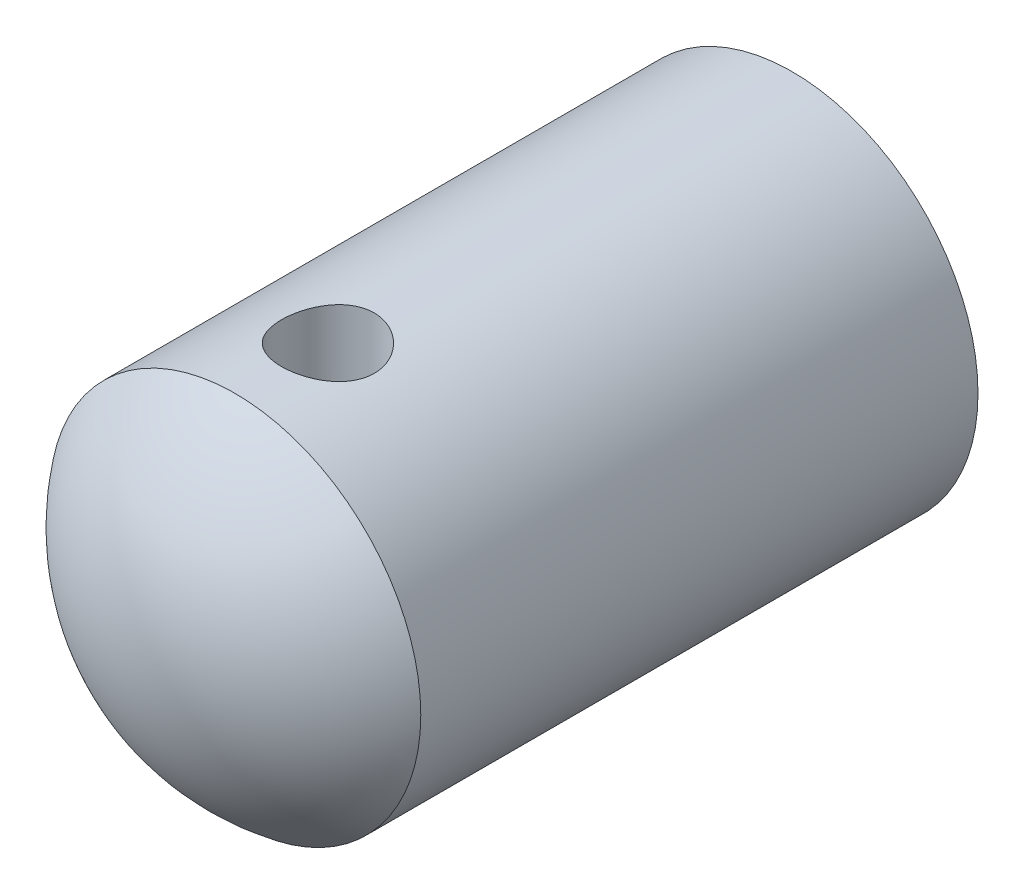
ISO-10303-21;
HEADER;
FILE_DESCRIPTION(('STEP AP214'),'2;1');
FILE_NAME('part.step','',(''),(''),'','','');
FILE_SCHEMA(('AUTOMOTIVE_DESIGN { 1 0 10303 214 1 1 1 1 }'));
ENDSEC;
DATA;
#1=APPLICATION_CONTEXT('core data for automotive mechanical design processes');
#2=APPLICATION_PROTOCOL_DEFINITION('international standard','automotive_design',2000,#1);
#3=PRODUCT_CONTEXT('',#1,'mechanical');
#4=PRODUCT('Part','Part','',(#3));
#5=PRODUCT_RELATED_PRODUCT_CATEGORY('part','',(#4));
#6=PRODUCT_DEFINITION_FORMATION('','',#4);
#7=PRODUCT_DEFINITION_CONTEXT('part definition',#1,'design');
#8=PRODUCT_DEFINITION('design','',#6,#7);
#9=PRODUCT_DEFINITION_SHAPE('','',#8);
#10=(LENGTH_UNIT() NAMED_UNIT(*) SI_UNIT(.MILLI.,.METRE.));
#11=(NAMED_UNIT(*) PLANE_ANGLE_UNIT() SI_UNIT($,.RADIAN.));
#12=(NAMED_UNIT(*) SI_UNIT($,.STERADIAN.) SOLID_ANGLE_UNIT());
#13=UNCERTAINTY_MEASURE_WITH_UNIT(LENGTH_MEASURE(1.E-05),#10,'distance_accuracy_value','');
#14=(GEOMETRIC_REPRESENTATION_CONTEXT(3) GLOBAL_UNCERTAINTY_ASSIGNED_CONTEXT((#13)) GLOBAL_UNIT_ASSIGNED_CONTEXT((#10,
#11,#12)) REPRESENTATION_CONTEXT('',''));
#15=CARTESIAN_POINT('',(0.,0.,0.));
#16=DIRECTION('',(0.,0.,1.));
#17=DIRECTION('',(1.,0.,0.));
#18=AXIS2_PLACEMENT_3D('',#15,#16,#17);
#19=CARTESIAN_POINT('',(0.,0.,120.));
#20=DIRECTION('',(0.,0.,-1.));
#21=DIRECTION('',(-1.,0.,0.));
#22=AXIS2_PLACEMENT_3D('',#19,#20,#21);
#23=CYLINDRICAL_SURFACE('',#22,40.);
#24=CARTESIAN_POINT('',(0.,-40.,110.));
#25=CARTESIAN_POINT('',(0.276276686131213,-39.9999993474412,109.999998834029));
#26=CARTESIAN_POINT('',(0.552576783631185,-39.9971305425548,109.988541017278));
#27=CARTESIAN_POINT('',(1.10318148436561,-39.9857330256128,109.942802754829));
#28=CARTESIAN_POINT('',(1.37748585631468,-39.9772036677926,109.908519705193));
#29=CARTESIAN_POINT('',(1.9222336066517,-39.9547164363919,109.817398561938));
#30=CARTESIAN_POINT('',(2.19267505387194,-39.9407559397862,109.760549569592));
#31=CARTESIAN_POINT('',(2.72764291200183,-39.907791142276,109.624766293579));
#32=CARTESIAN_POINT('',(2.9921691888711,-39.8887867271994,109.545831509985));
#33=CARTESIAN_POINT('',(3.51314528556497,-39.8462801108945,109.366621628135));
#34=CARTESIAN_POINT('',(3.76960471060799,-39.8227835143951,109.26637310496));
#35=CARTESIAN_POINT('',(4.27306727635446,-39.7719112039748,109.045246902843));
#36=CARTESIAN_POINT('',(4.52007036697146,-39.7445354695114,108.924369114656));
#37=CARTESIAN_POINT('',(5.00296312812469,-39.6866412375216,108.662894261255));
#38=CARTESIAN_POINT('',(5.23885470211663,-39.6561232811474,108.522300589999));
#39=CARTESIAN_POINT('',(5.69814612012694,-39.5927379916158,108.222310872375));
#40=CARTESIAN_POINT('',(5.92154144861157,-39.5598698188549,108.062908093187));
#41=CARTESIAN_POINT('',(6.35826451188649,-39.4920522419941,107.723364111462));
#42=CARTESIAN_POINT('',(6.57133697514704,-39.4570759423501,107.542899879583));
#43=CARTESIAN_POINT('',(6.98169544574758,-39.3865370660522,107.16476180459));
#44=CARTESIAN_POINT('',(7.17897420534623,-39.3509742291619,106.967080146287));
#45=CARTESIAN_POINT('',(7.5563689006375,-39.2802515251638,106.555850880297));
#46=CARTESIAN_POINT('',(7.73648287233044,-39.2450917045731,106.342301461981));
#47=CARTESIAN_POINT('',(8.07823801416378,-39.176172014405,105.900843693481));
#48=CARTESIAN_POINT('',(8.23988747905261,-39.1424115205899,105.672941862732));
#49=CARTESIAN_POINT('',(8.54601878600911,-39.0767252483032,105.20057500516));
#50=CARTESIAN_POINT('',(8.69019944369822,-39.0448355320653,104.955909616724));
#51=CARTESIAN_POINT('',(8.95732951917683,-38.9844200167823,104.45497352556));
#52=CARTESIAN_POINT('',(9.08028719545704,-38.9558929106225,104.198707386251));
#53=CARTESIAN_POINT('',(9.30408470665821,-38.9030492204288,103.676244662164));
#54=CARTESIAN_POINT('',(9.40492284026946,-38.8787329602997,103.410047315376));
#55=CARTESIAN_POINT('',(9.58363487145948,-38.8350668183171,102.869656183086));
#56=CARTESIAN_POINT('',(9.66150931910943,-38.8157168175037,102.595462589298));
#57=CARTESIAN_POINT('',(9.79230027358012,-38.7829255292181,102.046662445358));
#58=CARTESIAN_POINT('',(9.84568542228694,-38.7693736587141,101.772174161763));
#59=CARTESIAN_POINT('',(9.92930040805545,-38.7480433223281,101.219470103496));
#60=CARTESIAN_POINT('',(9.95953052583201,-38.7402647864543,100.941254374053));
#61=CARTESIAN_POINT('',(9.99656649300495,-38.7307245693961,100.383204676321));
#62=CARTESIAN_POINT('',(10.0033756681978,-38.7289620339339,100.103370943442));
#63=CARTESIAN_POINT('',(9.99351800395716,-38.7315068742112,99.5441471923369));
#64=CARTESIAN_POINT('',(9.97685149095119,-38.7358141655503,99.264757167995));
#65=CARTESIAN_POINT('',(9.92088090803788,-38.7501861592384,98.7152697683662));
#66=CARTESIAN_POINT('',(9.88213622905447,-38.7601085512958,98.4451114596009));
#67=CARTESIAN_POINT('',(9.7827640364595,-38.7853084477115,97.9091104962177));
#68=CARTESIAN_POINT('',(9.72213692994241,-38.8005858524465,97.6432677614104));
#69=CARTESIAN_POINT('',(9.5794994253827,-38.8360474723497,97.1177596286762));
#70=CARTESIAN_POINT('',(9.49749183020054,-38.8562310443238,96.8580934259066));
#71=CARTESIAN_POINT('',(9.3126930925472,-38.9009354625423,96.346544686431));
#72=CARTESIAN_POINT('',(9.20989415752296,-38.9254579345653,96.0946651090638));
#73=CARTESIAN_POINT('',(8.98318087798949,-38.9784060382958,95.5979870615736));
#74=CARTESIAN_POINT('',(8.85906808208168,-39.0068678154364,95.3532830550915));
#75=CARTESIAN_POINT('',(8.59133539716697,-39.0667091387545,94.875155226747));
#76=CARTESIAN_POINT('',(8.44771463246085,-39.0980888158945,94.6417319119052));
#77=CARTESIAN_POINT('',(8.14193923712406,-39.1629064792632,94.1876197412456));
#78=CARTESIAN_POINT('',(7.97978227057928,-39.196344724665,93.9669324956998));
#79=CARTESIAN_POINT('',(7.63801932614917,-39.2643733021678,93.5396983316009));
#80=CARTESIAN_POINT('',(7.45841302952062,-39.2989636553065,93.3331516714683));
#81=CARTESIAN_POINT('',(7.07753342014247,-39.3693672656826,92.9298063758053));
#82=CARTESIAN_POINT('',(6.87578778904274,-39.4051872340633,92.7334546345399));
#83=CARTESIAN_POINT('',(6.45639557413328,-39.4760709124524,92.3583970307196));
#84=CARTESIAN_POINT('',(6.23874924957814,-39.5111346347791,92.1796908805719));
#85=CARTESIAN_POINT('',(5.78892992120895,-39.579540756308,91.8411059550386));
#86=CARTESIAN_POINT('',(5.55675333032784,-39.6128827267264,91.6812318569949));
#87=CARTESIAN_POINT('',(5.07955796537571,-39.6768951897208,91.3815640634134));
#88=CARTESIAN_POINT('',(4.83454420385182,-39.7075667127597,91.2417626086746));
#89=CARTESIAN_POINT('',(4.33232990172721,-39.765500548439,90.982736830804));
#90=CARTESIAN_POINT('',(4.07508804682037,-39.7927499750226,90.863589677737));
#91=CARTESIAN_POINT('',(3.55104953194883,-39.842933142722,90.6474399445035));
#92=CARTESIAN_POINT('',(3.28425281831401,-39.8658668595916,90.5504374887476));
#93=CARTESIAN_POINT('',(2.74306842511355,-39.9067562557545,90.3793921231009));
#94=CARTESIAN_POINT('',(2.468681934248,-39.9247127097788,90.3053456398076));
#95=CARTESIAN_POINT('',(1.91431246833766,-39.9551305553882,90.1808295155556));
#96=CARTESIAN_POINT('',(1.63432963144589,-39.9675920824478,90.1303592933341));
#97=CARTESIAN_POINT('',(1.07810473910744,-39.9864118920525,90.0544255275337));
#98=CARTESIAN_POINT('',(0.801950449451516,-39.9929182716286,90.0283548039809));
#99=CARTESIAN_POINT('',(0.248356982178921,-40.0001867706141,89.9992428793427));
#100=CARTESIAN_POINT('',(-0.0290821734368928,-40.00094898802,89.9962012853759));
#101=CARTESIAN_POINT('',(-0.583185768536729,-39.9967080274712,90.0131727122316));
#102=CARTESIAN_POINT('',(-0.859850270347598,-39.991705327538,90.0331838215452));
#103=CARTESIAN_POINT('',(-1.41040357408703,-39.9760753561965,90.0960852537547));
#104=CARTESIAN_POINT('',(-1.684292386864,-39.9654481067795,90.1389754871954));
#105=CARTESIAN_POINT('',(-2.22327800001183,-39.9390630903775,90.2464658772862));
#106=CARTESIAN_POINT('',(-2.48844496615133,-39.9233838802729,90.3107340771903));
#107=CARTESIAN_POINT('',(-3.01234098850949,-39.8872755198411,90.460606222222));
#108=CARTESIAN_POINT('',(-3.27107012780182,-39.8668464308415,90.5462098918797));
#109=CARTESIAN_POINT('',(-3.78033449341546,-39.8217832029462,90.7380829916468));
#110=CARTESIAN_POINT('',(-4.03087057538303,-39.7971495048429,90.8443502556393));
#111=CARTESIAN_POINT('',(-4.52223860683227,-39.7443134144047,91.076813406541));
#112=CARTESIAN_POINT('',(-4.76306687714366,-39.7161096855189,91.2030167615497));
#113=CARTESIAN_POINT('',(-5.23752187646089,-39.6563555782416,91.4768144391436));
#114=CARTESIAN_POINT('',(-5.47094820846399,-39.624755177931,91.6247451226261));
#115=CARTESIAN_POINT('',(-5.92457828206943,-39.5594728981749,91.9392585277773));
#116=CARTESIAN_POINT('',(-6.14478145192341,-39.5257909288532,92.1058420550742));
#117=CARTESIAN_POINT('',(-6.57058731767183,-39.4572414078492,92.4565610770555));
#118=CARTESIAN_POINT('',(-6.77618804792627,-39.4223736974844,92.6406989269493));
#119=CARTESIAN_POINT('',(-7.17145280648187,-39.352389485896,93.0253094937133));
#120=CARTESIAN_POINT('',(-7.36111662432891,-39.3172729813935,93.2257824262268));
#121=CARTESIAN_POINT('',(-7.72774540600503,-39.2468808270323,93.6469067875468));
#122=CARTESIAN_POINT('',(-7.90428315344572,-39.2116225166925,93.8679333114596));
#123=CARTESIAN_POINT('',(-8.23811583861649,-39.1428473927591,94.3243169121817));
#124=CARTESIAN_POINT('',(-8.39541126484779,-39.1093305349678,94.5596736249657));
#125=CARTESIAN_POINT('',(-8.68966091610262,-39.0450059331012,95.0431965511685));
#126=CARTESIAN_POINT('',(-8.826611225845,-39.0141987109411,95.2913652178113));
#127=CARTESIAN_POINT('',(-9.07904857587184,-38.9562273945278,95.7986770336816));
#128=CARTESIAN_POINT('',(-9.19454421025633,-38.9290618427496,96.0578157373428));
#129=CARTESIAN_POINT('',(-9.40261638230816,-38.879328567111,96.58381347658));
#130=CARTESIAN_POINT('',(-9.4953221211479,-38.8567350588003,96.850618939403));
#131=CARTESIAN_POINT('',(-9.65791512678119,-38.8166419949047,97.3914732005703));
#132=CARTESIAN_POINT('',(-9.72780242555448,-38.7991424321806,97.6655219887626));
#133=CARTESIAN_POINT('',(-9.84414605907407,-38.7697871241357,98.218796716723));
#134=CARTESIAN_POINT('',(-9.89060669326283,-38.7579303432304,98.4980216967569));
#135=CARTESIAN_POINT('',(-9.95970176366048,-38.740232565125,99.0595913221852));
#136=CARTESIAN_POINT('',(-9.98233677310327,-38.7343914231915,99.3419358923586));
#137=CARTESIAN_POINT('',(-10.0032722204452,-38.7289898198564,99.8994475489982));
#138=CARTESIAN_POINT('',(-10.0022536208647,-38.7292536033208,100.174587591908));
#139=CARTESIAN_POINT('',(-9.97755972226948,-38.7356226876572,100.723776907411));
#140=CARTESIAN_POINT('',(-9.95388488170566,-38.741727870328,100.997826201963));
#141=CARTESIAN_POINT('',(-9.88408248409727,-38.7595950267271,101.542852997241));
#142=CARTESIAN_POINT('',(-9.83795552407141,-38.771356850041,101.81383057945));
#143=CARTESIAN_POINT('',(-9.72363550707292,-38.8001853309248,102.350801016534));
#144=CARTESIAN_POINT('',(-9.65544233948357,-38.8172520150877,102.616793846414));
#145=CARTESIAN_POINT('',(-9.49803119722784,-38.8560667748234,103.140328204053));
#146=CARTESIAN_POINT('',(-9.40894556510169,-38.8777853112568,103.397911755833));
#147=CARTESIAN_POINT('',(-9.21017526998103,-38.9253530530372,103.904713754185));
#148=CARTESIAN_POINT('',(-9.10048316605147,-38.9512037499907,104.153929140599));
#149=CARTESIAN_POINT('',(-8.86133636008454,-39.0063041604206,104.642265452049));
#150=CARTESIAN_POINT('',(-8.73188345974384,-39.0355535639609,104.881387294832));
#151=CARTESIAN_POINT('',(-8.45410693455431,-39.0966532023658,105.348066951001));
#152=CARTESIAN_POINT('',(-8.30578240349574,-39.1285035621011,105.575624208325));
#153=CARTESIAN_POINT('',(-7.98715019319339,-39.1948030871517,106.023530819321));
#154=CARTESIAN_POINT('',(-7.81637004459894,-39.2292983680228,106.243537368254));
#155=CARTESIAN_POINT('',(-7.45713945647237,-39.2991672194456,106.668468963869));
#156=CARTESIAN_POINT('',(-7.2686887399824,-39.3345408037568,106.873393774077));
#157=CARTESIAN_POINT('',(-6.87530741513624,-39.4052037523679,107.266881073601));
#158=CARTESIAN_POINT('',(-6.67037284045601,-39.4404930942815,107.455439602054));
#159=CARTESIAN_POINT('',(-6.24539503784925,-39.5100163411835,107.814889147313));
#160=CARTESIAN_POINT('',(-6.0253521279286,-39.5442502683646,107.985780535795));
#161=CARTESIAN_POINT('',(-5.56740359032029,-39.6113435460404,108.311705186542));
#162=CARTESIAN_POINT('',(-5.32924418986214,-39.6441661227826,108.466389716296));
#163=CARTESIAN_POINT('',(-4.84042651516458,-39.7068124330665,108.755044537687));
#164=CARTESIAN_POINT('',(-4.58977286613402,-39.7366372641816,108.88902242044));
#165=CARTESIAN_POINT('',(-4.07773321835857,-39.7924413064267,109.135248391094));
#166=CARTESIAN_POINT('',(-3.81635191156582,-39.8184221763682,109.247505858633));
#167=CARTESIAN_POINT('',(-3.28463135766317,-39.8658048489492,109.449446743792));
#168=CARTESIAN_POINT('',(-3.01429346885352,-39.8872073422793,109.539133566764));
#169=CARTESIAN_POINT('',(-2.51829671794581,-39.9212703038144,109.68047406555));
#170=CARTESIAN_POINT('',(-2.29382401207508,-39.9348181936603,109.736110394683));
#171=CARTESIAN_POINT('',(-1.84138358325463,-39.9582356855493,109.83172183439));
#172=CARTESIAN_POINT('',(-1.61341610527137,-39.9681055441881,109.871698037494));
#173=CARTESIAN_POINT('',(-1.15510194680525,-39.9839757782934,109.935757826292));
#174=CARTESIAN_POINT('',(-0.924755035654602,-39.9899757749611,109.9598398562));
#175=CARTESIAN_POINT('',(-0.462944023658253,-39.9979876402783,109.991959343887));
#176=CARTESIAN_POINT('',(-0.231480229261553,-40.0000005467506,110.000000976916));
#177=CARTESIAN_POINT('',(0.,-40.,110.));
#178=B_SPLINE_CURVE_WITH_KNOTS('',3,(#24,#25,#26,#27,#28,#29,#30,#31,#32,#33,#34,#35,#36,#37,
#38,#39,#40,#41,#42,#43,#44,#45,#46,#47,#48,#49,#50,#51,#52,#53,#54,#55,#56,#57,#58,#59,#60,#61,
#62,#63,#64,#65,#66,#67,#68,#69,#70,#71,#72,#73,#74,#75,#76,#77,#78,#79,#80,#81,#82,#83,#84,#85,
#86,#87,#88,#89,#90,#91,#92,#93,#94,#95,#96,#97,#98,#99,#100,#101,#102,#103,#104,#105,#106,#107,
#108,#109,#110,#111,#112,#113,#114,#115,#116,#117,#118,#119,#120,#121,#122,#123,#124,#125,#126,
#127,#128,#129,#130,#131,#132,#133,#134,#135,#136,#137,#138,#139,#140,#141,#142,#143,#144,#145,
#146,#147,#148,#149,#150,#151,#152,#153,#154,#155,#156,#157,#158,#159,#160,#161,#162,#163,#164,
#165,#166,#167,#168,#169,#170,#171,#172,#173,#174,#175,#176,#177),.UNSPECIFIED.,.T.,.F.,(4,2,2,
2,2,2,2,2,2,2,2,2,2,2,2,2,2,2,2,2,2,2,2,2,2,2,2,2,2,2,2,2,2,2,2,2,2,2,2,2,2,2,2,2,2,2,2,2,2,2,2,
2,2,2,2,2,2,2,2,2,2,2,2,2,2,2,2,2,2,2,2,2,2,2,2,2,4),(0.,0.828619089346024,1.65733272509384,
2.48644709461136,3.31558023322879,4.14368556550279,4.97179528331468,5.79976262221085,
6.62802724066694,7.47127713116486,8.31491179752392,9.15864287718379,10.0019934272018,
10.8582731380175,11.7142188901354,12.5702304536773,13.4262215106876,14.2650679436646,
15.1039042069121,15.9426213496824,16.7813268302768,17.5996711950355,18.4180003363331,
19.2362222532306,20.0547514082784,20.8813618760701,21.7080094621042,22.5347613365453,
23.3615283159286,24.2119083751323,25.0622745723147,25.9128515327318,26.7630988071573,
27.6164573976883,28.4698207823288,29.3230512628311,30.1762607061874,31.0076247471077,
31.8389746047657,32.6702555326212,33.501533210271,34.3204625761169,35.1393813690201,
35.958214362793,36.7773548236264,37.6108625247906,38.4444062395818,39.2780619461831,
40.1117286598548,40.9659053768095,41.8200604044369,42.6743795961243,43.5283558317059,
44.3773728438563,45.2263886661149,46.0752486136646,46.9240881375558,47.7485215778696,
48.5729383360593,49.3973331735861,50.2217321438248,51.041043688627,51.8606516550366,
52.6801849380243,53.4997575896047,54.3407066639187,55.1816689209665,56.0228341380647,
56.8639816554284,57.7205715620531,58.5768466916346,59.4327512222289,60.2885265404584,
60.9829517481761,61.6773285006459,62.3717732114252,63.0660371374129),.UNSPECIFIED.);
#179=CARTESIAN_POINT('',(0.,-40.,110.));
#180=VERTEX_POINT('',#179);
#181=EDGE_CURVE('E54',#180,#180,#178,.T.);
#182=ORIENTED_EDGE('',*,*,#181,.T.);
#183=EDGE_LOOP('',(#182));
#184=FACE_BOUND('',#183,.T.);
#185=CARTESIAN_POINT('',(0.,0.,120.));
#186=DIRECTION('',(0.,0.,1.));
#187=DIRECTION('',(1.,0.,0.));
#188=AXIS2_PLACEMENT_3D('',#185,#186,#187);
#189=CIRCLE('',#188,40.);
#190=CARTESIAN_POINT('',(40.,0.,120.));
#191=VERTEX_POINT('',#190);
#192=EDGE_CURVE('E10',#191,#191,#189,.T.);
#193=ORIENTED_EDGE('',*,*,#192,.F.);
#194=EDGE_LOOP('',(#193));
#195=FACE_BOUND('',#194,.T.);
#196=CARTESIAN_POINT('',(0.,0.,0.));
#197=DIRECTION('',(0.,0.,1.));
#198=DIRECTION('',(1.,0.,0.));
#199=AXIS2_PLACEMENT_3D('',#196,#197,#198);
#200=CIRCLE('',#199,40.);
#201=CARTESIAN_POINT('',(40.,0.,0.));
#202=VERTEX_POINT('',#201);
#203=EDGE_CURVE('E37',#202,#202,#200,.T.);
#204=ORIENTED_EDGE('',*,*,#203,.T.);
#205=EDGE_LOOP('',(#204));
#206=FACE_BOUND('',#205,.T.);
#207=CARTESIAN_POINT('',(0.,40.,90.));
#208=CARTESIAN_POINT('',(-0.276276686131213,39.9999993474412,90.000001165971));
#209=CARTESIAN_POINT('',(-0.552576783631185,39.9971305425548,90.0114589827224));
#210=CARTESIAN_POINT('',(-1.10318148436561,39.9857330256128,90.0571972451707));
#211=CARTESIAN_POINT('',(-1.37748585631468,39.9772036677926,90.0914802948069));
#212=CARTESIAN_POINT('',(-1.9222336066517,39.9547164363919,90.1826014380616));
#213=CARTESIAN_POINT('',(-2.19267505387194,39.9407559397862,90.239450430408));
#214=CARTESIAN_POINT('',(-2.72764291200183,39.907791142276,90.3752337064209));
#215=CARTESIAN_POINT('',(-2.9921691888711,39.8887867271994,90.4541684900147));
#216=CARTESIAN_POINT('',(-3.51314528556497,39.8462801108945,90.6333783718649));
#217=CARTESIAN_POINT('',(-3.76960471060799,39.8227835143951,90.7336268950404));
#218=CARTESIAN_POINT('',(-4.27306727635446,39.7719112039748,90.9547530971568));
#219=CARTESIAN_POINT('',(-4.52007036697146,39.7445354695114,91.0756308853443));
#220=CARTESIAN_POINT('',(-5.00296312812469,39.6866412375216,91.3371057387446));
#221=CARTESIAN_POINT('',(-5.23885470211663,39.6561232811474,91.477699410001));
#222=CARTESIAN_POINT('',(-5.69814612012694,39.5927379916158,91.777689127625));
#223=CARTESIAN_POINT('',(-5.92154144861157,39.5598698188549,91.9370919068127));
#224=CARTESIAN_POINT('',(-6.35826451188649,39.4920522419941,92.2766358885384));
#225=CARTESIAN_POINT('',(-6.57133697514704,39.4570759423501,92.4571001204172));
#226=CARTESIAN_POINT('',(-6.98169544574758,39.3865370660522,92.8352381954096));
#227=CARTESIAN_POINT('',(-7.17897420534624,39.3509742291619,93.0329198537134));
#228=CARTESIAN_POINT('',(-7.5563689006375,39.2802515251638,93.4441491197031));
#229=CARTESIAN_POINT('',(-7.73648287233043,39.2450917045731,93.6576985380191));
#230=CARTESIAN_POINT('',(-8.07823801416377,39.176172014405,94.0991563065186));
#231=CARTESIAN_POINT('',(-8.2398874790526,39.1424115205899,94.3270581372682));
#232=CARTESIAN_POINT('',(-8.54601878600911,39.0767252483032,94.7994249948401));
#233=CARTESIAN_POINT('',(-8.69019944369822,39.0448355320653,95.0440903832765));
#234=CARTESIAN_POINT('',(-8.95732951917683,38.9844200167823,95.5450264744405));
#235=CARTESIAN_POINT('',(-9.08028719545704,38.9558929106225,95.8012926137494));
#236=CARTESIAN_POINT('',(-9.3040847066582,38.9030492204288,96.3237553378355));
#237=CARTESIAN_POINT('',(-9.40492284026946,38.8787329602997,96.5899526846236));
#238=CARTESIAN_POINT('',(-9.58363487145948,38.8350668183171,97.1303438169142));
#239=CARTESIAN_POINT('',(-9.66150931910942,38.8157168175037,97.404537410702));
#240=CARTESIAN_POINT('',(-9.79230027358011,38.7829255292181,97.9533375546424));
#241=CARTESIAN_POINT('',(-9.84568542228694,38.7693736587141,98.227825838237));
#242=CARTESIAN_POINT('',(-9.92930040805545,38.7480433223281,98.7805298965043));
#243=CARTESIAN_POINT('',(-9.959530525832,38.7402647864544,99.0587456259466));
#244=CARTESIAN_POINT('',(-9.99656649300495,38.7307245693961,99.6167953236792));
#245=CARTESIAN_POINT('',(-10.0033756681978,38.7289620339339,99.896629056558));
#246=CARTESIAN_POINT('',(-9.99351800395716,38.7315068742112,100.455852807663));
#247=CARTESIAN_POINT('',(-9.97685149095119,38.7358141655503,100.735242832005));
#248=CARTESIAN_POINT('',(-9.92088090803788,38.7501861592384,101.284730231634));
#249=CARTESIAN_POINT('',(-9.88213622905447,38.7601085512958,101.554888540399));
#250=CARTESIAN_POINT('',(-9.7827640364595,38.7853084477115,102.090889503782));
#251=CARTESIAN_POINT('',(-9.7221369299424,38.8005858524465,102.35673223859));
#252=CARTESIAN_POINT('',(-9.5794994253827,38.8360474723497,102.882240371324));
#253=CARTESIAN_POINT('',(-9.49749183020054,38.8562310443238,103.141906574093));
#254=CARTESIAN_POINT('',(-9.3126930925472,38.9009354625423,103.653455313569));
#255=CARTESIAN_POINT('',(-9.20989415752296,38.9254579345653,103.905334890936));
#256=CARTESIAN_POINT('',(-8.98318087798949,38.9784060382958,104.402012938426));
#257=CARTESIAN_POINT('',(-8.85906808208167,39.0068678154364,104.646716944909));
#258=CARTESIAN_POINT('',(-8.59133539716696,39.0667091387545,105.124844773253));
#259=CARTESIAN_POINT('',(-8.44771463246085,39.0980888158945,105.358268088095));
#260=CARTESIAN_POINT('',(-8.14193923712406,39.1629064792632,105.812380258754));
#261=CARTESIAN_POINT('',(-7.97978227057928,39.196344724665,106.0330675043));
#262=CARTESIAN_POINT('',(-7.63801932614917,39.2643733021678,106.460301668399));
#263=CARTESIAN_POINT('',(-7.45841302952062,39.2989636553065,106.666848328532));
#264=CARTESIAN_POINT('',(-7.07753342014247,39.3693672656826,107.070193624195));
#265=CARTESIAN_POINT('',(-6.87578778904274,39.4051872340633,107.26654536546));
#266=CARTESIAN_POINT('',(-6.45639557413328,39.4760709124524,107.64160296928));
#267=CARTESIAN_POINT('',(-6.23874924957814,39.5111346347791,107.820309119428));
#268=CARTESIAN_POINT('',(-5.78892992120895,39.579540756308,108.158894044961));
#269=CARTESIAN_POINT('',(-5.55675333032784,39.6128827267264,108.318768143005));
#270=CARTESIAN_POINT('',(-5.07955796537571,39.6768951897208,108.618435936587));
#271=CARTESIAN_POINT('',(-4.83454420385182,39.7075667127597,108.758237391325));
#272=CARTESIAN_POINT('',(-4.33232990172721,39.765500548439,109.017263169196));
#273=CARTESIAN_POINT('',(-4.07508804682037,39.7927499750226,109.136410322263));
#274=CARTESIAN_POINT('',(-3.55104953194883,39.842933142722,109.352560055496));
#275=CARTESIAN_POINT('',(-3.28425281831401,39.8658668595916,109.449562511252));
#276=CARTESIAN_POINT('',(-2.74306842511355,39.9067562557545,109.620607876899));
#277=CARTESIAN_POINT('',(-2.468681934248,39.9247127097788,109.694654360192));
#278=CARTESIAN_POINT('',(-1.91431246833766,39.9551305553882,109.819170484444));
#279=CARTESIAN_POINT('',(-1.6343296314459,39.9675920824478,109.869640706666));
#280=CARTESIAN_POINT('',(-1.07810473910744,39.9864118920525,109.945574472466));
#281=CARTESIAN_POINT('',(-0.801950449451516,39.9929182716286,109.971645196019));
#282=CARTESIAN_POINT('',(-0.248356982178921,40.0001867706141,110.000757120657));
#283=CARTESIAN_POINT('',(0.0290821734368927,40.00094898802,110.003798714624));
#284=CARTESIAN_POINT('',(0.583185768536729,39.9967080274712,109.986827287768));
#285=CARTESIAN_POINT('',(0.859850270347598,39.991705327538,109.966816178455));
#286=CARTESIAN_POINT('',(1.41040357408703,39.9760753561965,109.903914746245));
#287=CARTESIAN_POINT('',(1.684292386864,39.9654481067795,109.861024512805));
#288=CARTESIAN_POINT('',(2.22327800001183,39.9390630903775,109.753534122714));
#289=CARTESIAN_POINT('',(2.48844496615132,39.9233838802729,109.68926592281));
#290=CARTESIAN_POINT('',(3.01234098850949,39.8872755198411,109.539393777778));
#291=CARTESIAN_POINT('',(3.27107012780182,39.8668464308415,109.45379010812));
#292=CARTESIAN_POINT('',(3.78033449341545,39.8217832029462,109.261917008353));
#293=CARTESIAN_POINT('',(4.03087057538302,39.7971495048429,109.155649744361));
#294=CARTESIAN_POINT('',(4.52223860683226,39.7443134144047,108.923186593459));
#295=CARTESIAN_POINT('',(4.76306687714365,39.7161096855189,108.79698323845));
#296=CARTESIAN_POINT('',(5.23752187646089,39.6563555782416,108.523185560856));
#297=CARTESIAN_POINT('',(5.47094820846398,39.624755177931,108.375254877374));
#298=CARTESIAN_POINT('',(5.92457828206942,39.5594728981749,108.060741472223));
#299=CARTESIAN_POINT('',(6.14478145192339,39.5257909288532,107.894157944926));
#300=CARTESIAN_POINT('',(6.57058731767181,39.4572414078492,107.543438922945));
#301=CARTESIAN_POINT('',(6.77618804792625,39.4223736974844,107.359301073051));
#302=CARTESIAN_POINT('',(7.17145280648186,39.352389485896,106.974690506287));
#303=CARTESIAN_POINT('',(7.3611166243289,39.3172729813935,106.774217573773));
#304=CARTESIAN_POINT('',(7.72774540600503,39.2468808270323,106.353093212453));
#305=CARTESIAN_POINT('',(7.90428315344572,39.2116225166925,106.13206668854));
#306=CARTESIAN_POINT('',(8.23811583861649,39.1428473927591,105.675683087818));
#307=CARTESIAN_POINT('',(8.39541126484779,39.1093305349678,105.440326375034));
#308=CARTESIAN_POINT('',(8.68966091610262,39.0450059331012,104.956803448832));
#309=CARTESIAN_POINT('',(8.826611225845,39.0141987109411,104.708634782189));
#310=CARTESIAN_POINT('',(9.07904857587184,38.9562273945278,104.201322966318));
#311=CARTESIAN_POINT('',(9.19454421025633,38.9290618427496,103.942184262657));
#312=CARTESIAN_POINT('',(9.40261638230816,38.879328567111,103.41618652342));
#313=CARTESIAN_POINT('',(9.4953221211479,38.8567350588003,103.149381060597));
#314=CARTESIAN_POINT('',(9.65791512678119,38.8166419949047,102.60852679943));
#315=CARTESIAN_POINT('',(9.72780242555448,38.7991424321806,102.334478011237));
#316=CARTESIAN_POINT('',(9.84414605907407,38.7697871241357,101.781203283277));
#317=CARTESIAN_POINT('',(9.89060669326283,38.7579303432304,101.501978303243));
#318=CARTESIAN_POINT('',(9.95970176366048,38.740232565125,100.940408677815));
#319=CARTESIAN_POINT('',(9.98233677310327,38.7343914231915,100.658064107641));
#320=CARTESIAN_POINT('',(10.0032722204452,38.7289898198564,100.100552451002));
#321=CARTESIAN_POINT('',(10.0022536208647,38.7292536033208,99.8254124080922));
#322=CARTESIAN_POINT('',(9.97755972226948,38.7356226876572,99.2762230925891));
#323=CARTESIAN_POINT('',(9.95388488170566,38.741727870328,99.0021737980369));
#324=CARTESIAN_POINT('',(9.88408248409728,38.7595950267271,98.4571470027588));
#325=CARTESIAN_POINT('',(9.83795552407141,38.771356850041,98.1861694205499));
#326=CARTESIAN_POINT('',(9.72363550707292,38.8001853309248,97.649198983466));
#327=CARTESIAN_POINT('',(9.65544233948357,38.8172520150877,97.3832061535864));
#328=CARTESIAN_POINT('',(9.49803119722784,38.8560667748234,96.8596717959474));
#329=CARTESIAN_POINT('',(9.40894556510169,38.8777853112568,96.6020882441674));
#330=CARTESIAN_POINT('',(9.21017526998103,38.9253530530372,96.0952862458155));
#331=CARTESIAN_POINT('',(9.10048316605147,38.9512037499907,95.8460708594006));
#332=CARTESIAN_POINT('',(8.86133636008454,39.0063041604206,95.3577345479506));
#333=CARTESIAN_POINT('',(8.73188345974384,39.0355535639609,95.1186127051682));
#334=CARTESIAN_POINT('',(8.45410693455431,39.0966532023658,94.6519330489992));
#335=CARTESIAN_POINT('',(8.30578240349574,39.1285035621011,94.4243757916751));
#336=CARTESIAN_POINT('',(7.98715019319339,39.1948030871517,93.9764691806793));
#337=CARTESIAN_POINT('',(7.81637004459894,39.2292983680228,93.7564626317456));
#338=CARTESIAN_POINT('',(7.45713945647237,39.2991672194456,93.3315310361314));
#339=CARTESIAN_POINT('',(7.2686887399824,39.3345408037568,93.1266062259228));
#340=CARTESIAN_POINT('',(6.87530741513624,39.4052037523679,92.7331189263994));
#341=CARTESIAN_POINT('',(6.670372840456,39.4404930942815,92.5445603979463));
#342=CARTESIAN_POINT('',(6.24539503784924,39.5100163411835,92.1851108526865));
#343=CARTESIAN_POINT('',(6.0253521279286,39.5442502683646,92.0142194642049));
#344=CARTESIAN_POINT('',(5.56740359032029,39.6113435460404,91.6882948134579));
#345=CARTESIAN_POINT('',(5.32924418986214,39.6441661227826,91.5336102837039));
#346=CARTESIAN_POINT('',(4.84042651516458,39.7068124330665,91.2449554623132));
#347=CARTESIAN_POINT('',(4.58977286613403,39.7366372641816,91.1109775795601));
#348=CARTESIAN_POINT('',(4.07773321835858,39.7924413064267,90.864751608906));
#349=CARTESIAN_POINT('',(3.81635191156582,39.8184221763682,90.7524941413673));
#350=CARTESIAN_POINT('',(3.28463135766317,39.8658048489492,90.5505532562084));
#351=CARTESIAN_POINT('',(3.01429346885352,39.8872073422793,90.4608664332357));
#352=CARTESIAN_POINT('',(2.51829671794581,39.9212703038144,90.3195259344499));
#353=CARTESIAN_POINT('',(2.29382401207508,39.9348181936603,90.2638896053175));
#354=CARTESIAN_POINT('',(1.84138358325463,39.9582356855493,90.1682781656103));
#355=CARTESIAN_POINT('',(1.61341610527137,39.9681055441881,90.1283019625059));
#356=CARTESIAN_POINT('',(1.15510194680525,39.9839757782934,90.064242173708));
#357=CARTESIAN_POINT('',(0.924755035654602,39.9899757749611,90.0401601438));
#358=CARTESIAN_POINT('',(0.462944023658253,39.9979876402783,90.0080406561135));
#359=CARTESIAN_POINT('',(0.231480229261553,40.0000005467506,89.9999990230836));
#360=CARTESIAN_POINT('',(0.,40.,90.));
#361=B_SPLINE_CURVE_WITH_KNOTS('',3,(#207,#208,#209,#210,#211,#212,#213,#214,#215,#216,#217,
#218,#219,#220,#221,#222,#223,#224,#225,#226,#227,#228,#229,#230,#231,#232,#233,#234,#235,#236,
#237,#238,#239,#240,#241,#242,#243,#244,#245,#246,#247,#248,#249,#250,#251,#252,#253,#254,#255,
#256,#257,#258,#259,#260,#261,#262,#263,#264,#265,#266,#267,#268,#269,#270,#271,#272,#273,#274,
#275,#276,#277,#278,#279,#280,#281,#282,#283,#284,#285,#286,#287,#288,#289,#290,#291,#292,#293,
#294,#295,#296,#297,#298,#299,#300,#301,#302,#303,#304,#305,#306,#307,#308,#309,#310,#311,#312,
#313,#314,#315,#316,#317,#318,#319,#320,#321,#322,#323,#324,#325,#326,#327,#328,#329,#330,#331,
#332,#333,#334,#335,#336,#337,#338,#339,#340,#341,#342,#343,#344,#345,#346,#347,#348,#349,#350,
#351,#352,#353,#354,#355,#356,#357,#358,#359,#360),.UNSPECIFIED.,.T.,.F.,(4,2,2,2,2,2,2,2,2,2,2,
2,2,2,2,2,2,2,2,2,2,2,2,2,2,2,2,2,2,2,2,2,2,2,2,2,2,2,2,2,2,2,2,2,2,2,2,2,2,2,2,2,2,2,2,2,2,2,2,
2,2,2,2,2,2,2,2,2,2,2,2,2,2,2,2,2,4),(0.,0.828619089346024,1.65733272509384,2.48644709461136,
3.31558023322879,4.14368556550279,4.97179528331468,5.79976262221085,6.62802724066694,
7.47127713116486,8.31491179752392,9.15864287718377,10.0019934272018,10.8582731380175,
11.7142188901354,12.5702304536773,13.4262215106876,14.2650679436646,15.103904206912,
15.9426213496824,16.7813268302768,17.5996711950355,18.4180003363331,19.2362222532306,
20.0547514082784,20.8813618760702,21.7080094621042,22.5347613365453,23.3615283159286,
24.2119083751323,25.0622745723147,25.9128515327318,26.7630988071573,27.6164573976883,
28.4698207823288,29.3230512628311,30.1762607061874,31.0076247471077,31.8389746047657,
32.6702555326212,33.501533210271,34.3204625761169,35.1393813690201,35.958214362793,
36.7773548236264,37.6108625247906,38.4444062395818,39.278061946183,40.1117286598548,
40.9659053768095,41.8200604044369,42.6743795961243,43.5283558317059,44.3773728438563,
45.2263886661149,46.0752486136646,46.9240881375558,47.7485215778696,48.5729383360593,
49.3973331735861,50.2217321438248,51.041043688627,51.8606516550367,52.6801849380243,
53.4997575896047,54.3407066639188,55.1816689209665,56.0228341380648,56.8639816554285,
57.7205715620531,58.5768466916346,59.4327512222289,60.2885265404584,60.9829517481761,
61.6773285006459,62.3717732114252,63.0660371374129),.UNSPECIFIED.);
#362=CARTESIAN_POINT('',(0.,40.,90.));
#363=VERTEX_POINT('',#362);
#364=EDGE_CURVE('E41',#363,#363,#361,.T.);
#365=ORIENTED_EDGE('',*,*,#364,.F.);
#366=EDGE_LOOP('',(#365));
#367=FACE_BOUND('',#366,.T.);
#368=ADVANCED_FACE('F30',(#184,#195,#206,#367),#23,.T.);
#369=CARTESIAN_POINT('',(0.,0.,90.));
#370=DIRECTION('',(0.,0.,1.));
#371=DIRECTION('',(1.,0.,0.));
#372=AXIS2_PLACEMENT_3D('',#369,#370,#371);
#373=SPHERICAL_SURFACE('',#372,50.);
#374=ORIENTED_EDGE('',*,*,#192,.T.);
#375=EDGE_LOOP('',(#374));
#376=FACE_BOUND('',#375,.T.);
#377=ADVANCED_FACE('F32',(#376),#373,.T.);
#378=CARTESIAN_POINT('',(0.,0.,0.));
#379=DIRECTION('',(0.,0.,1.));
#380=DIRECTION('',(1.,0.,0.));
#381=AXIS2_PLACEMENT_3D('',#378,#379,#380);
#382=PLANE('',#381);
#383=ORIENTED_EDGE('',*,*,#203,.F.);
#384=EDGE_LOOP('',(#383));
#385=FACE_BOUND('',#384,.T.);
#386=ADVANCED_FACE('F66',(#385),#382,.F.);
#387=CARTESIAN_POINT('',(0.,50.,100.));
#388=DIRECTION('',(0.,-1.,0.));
#389=DIRECTION('',(0.,0.,-1.));
#390=AXIS2_PLACEMENT_3D('',#387,#388,#389);
#391=CYLINDRICAL_SURFACE('',#390,10.);
#392=CARTESIAN_POINT('',(0.,20.,100.));
#393=DIRECTION('',(0.,1.,0.));
#394=DIRECTION('',(0.,0.,1.));
#395=AXIS2_PLACEMENT_3D('',#392,#393,#394);
#396=CIRCLE('',#395,10.);
#397=CARTESIAN_POINT('',(0.,20.,110.));
#398=VERTEX_POINT('',#397);
#399=EDGE_CURVE('E46',#398,#398,#396,.T.);
#400=ORIENTED_EDGE('',*,*,#399,.F.);
#401=EDGE_LOOP('',(#400));
#402=FACE_BOUND('',#401,.T.);
#403=ORIENTED_EDGE('',*,*,#364,.T.);
#404=EDGE_LOOP('',(#403));
#405=FACE_BOUND('',#404,.T.);
#406=ADVANCED_FACE('F61',(#402,#405),#391,.F.);
#407=CARTESIAN_POINT('',(0.,20.,100.));
#408=DIRECTION('',(0.,1.,0.));
#409=DIRECTION('',(0.,0.,1.));
#410=AXIS2_PLACEMENT_3D('',#407,#408,#409);
#411=PLANE('',#410);
#412=ORIENTED_EDGE('',*,*,#399,.T.);
#413=EDGE_LOOP('',(#412));
#414=FACE_BOUND('',#413,.T.);
#415=ADVANCED_FACE('F65',(#414),#411,.T.);
#416=CARTESIAN_POINT('',(0.,-50.,100.));
#417=DIRECTION('',(0.,1.,0.));
#418=DIRECTION('',(0.,0.,1.));
#419=AXIS2_PLACEMENT_3D('',#416,#417,#418);
#420=CYLINDRICAL_SURFACE('',#419,10.);
#421=CARTESIAN_POINT('',(0.,-20.,100.));
#422=DIRECTION('',(0.,1.,0.));
#423=DIRECTION('',(0.,0.,1.));
#424=AXIS2_PLACEMENT_3D('',#421,#422,#423);
#425=CIRCLE('',#424,10.);
#426=CARTESIAN_POINT('',(0.,-20.,110.));
#427=VERTEX_POINT('',#426);
#428=EDGE_CURVE('E84',#427,#427,#425,.T.);
#429=ORIENTED_EDGE('',*,*,#428,.T.);
#430=EDGE_LOOP('',(#429));
#431=FACE_BOUND('',#430,.T.);
#432=ORIENTED_EDGE('',*,*,#181,.F.);
#433=EDGE_LOOP('',(#432));
#434=FACE_BOUND('',#433,.T.);
#435=ADVANCED_FACE('F89',(#431,#434),#420,.F.);
#436=CARTESIAN_POINT('',(0.,-20.,100.));
#437=DIRECTION('',(0.,-1.,0.));
#438=DIRECTION('',(0.,0.,1.));
#439=AXIS2_PLACEMENT_3D('',#436,#437,#438);
#440=PLANE('',#439);
#441=ORIENTED_EDGE('',*,*,#428,.F.);
#442=EDGE_LOOP('',(#441));
#443=FACE_BOUND('',#442,.T.);
#444=ADVANCED_FACE('F91',(#443),#440,.T.);
#445=CLOSED_SHELL('',(#368,#377,#386,#406,#415,#435,#444));
#446=MANIFOLD_SOLID_BREP('B2',#445);
#447=ADVANCED_BREP_SHAPE_REPRESENTATION('',(#18,#446),#14);
#448=SHAPE_DEFINITION_REPRESENTATION(#9,#447);
ENDSEC;
END-ISO-10303-21;
